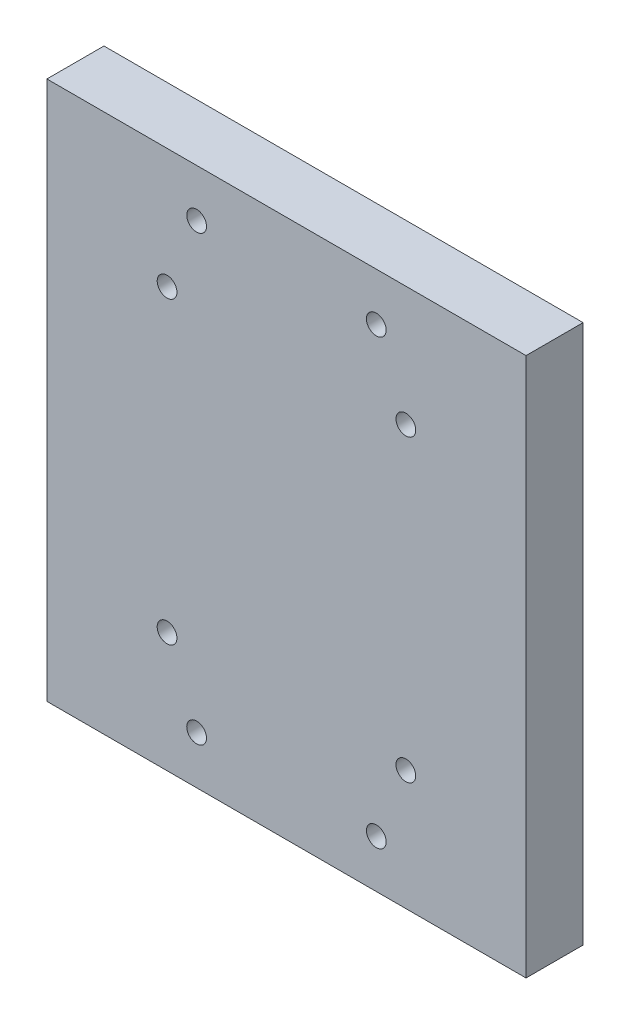
ISO-10303-21;
HEADER;
FILE_DESCRIPTION(('STEP AP214'),'2;1');
FILE_NAME('part.step','',(''),(''),'','','');
FILE_SCHEMA(('AUTOMOTIVE_DESIGN { 1 0 10303 214 1 1 1 1 }'));
ENDSEC;
DATA;
#1=APPLICATION_CONTEXT('core data for automotive mechanical design processes');
#2=APPLICATION_PROTOCOL_DEFINITION('international standard','automotive_design',2000,#1);
#3=PRODUCT_CONTEXT('',#1,'mechanical');
#4=PRODUCT('Part','Part','',(#3));
#5=PRODUCT_RELATED_PRODUCT_CATEGORY('part','',(#4));
#6=PRODUCT_DEFINITION_FORMATION('','',#4);
#7=PRODUCT_DEFINITION_CONTEXT('part definition',#1,'design');
#8=PRODUCT_DEFINITION('design','',#6,#7);
#9=PRODUCT_DEFINITION_SHAPE('','',#8);
#10=(LENGTH_UNIT() NAMED_UNIT(*) SI_UNIT(.MILLI.,.METRE.));
#11=(NAMED_UNIT(*) PLANE_ANGLE_UNIT() SI_UNIT($,.RADIAN.));
#12=(NAMED_UNIT(*) SI_UNIT($,.STERADIAN.) SOLID_ANGLE_UNIT());
#13=UNCERTAINTY_MEASURE_WITH_UNIT(LENGTH_MEASURE(1.E-05),#10,'distance_accuracy_value','');
#14=(GEOMETRIC_REPRESENTATION_CONTEXT(3) GLOBAL_UNCERTAINTY_ASSIGNED_CONTEXT((#13)) GLOBAL_UNIT_ASSIGNED_CONTEXT((#10,
#11,#12)) REPRESENTATION_CONTEXT('',''));
#15=CARTESIAN_POINT('',(0.,0.,0.));
#16=DIRECTION('',(0.,0.,1.));
#17=DIRECTION('',(1.,0.,0.));
#18=AXIS2_PLACEMENT_3D('',#15,#16,#17);
#19=CARTESIAN_POINT('',(40.,0.,9.53));
#20=DIRECTION('',(0.,1.,0.));
#21=DIRECTION('',(0.,0.,1.));
#22=AXIS2_PLACEMENT_3D('',#19,#20,#21);
#23=PLANE('',#22);
#24=DIRECTION('',(1.,0.,0.));
#25=VECTOR('',#24,1.);
#26=CARTESIAN_POINT('',(40.,0.,0.));
#27=LINE('',#26,#25);
#28=CARTESIAN_POINT('',(0.,0.,0.));
#29=VERTEX_POINT('',#28);
#30=CARTESIAN_POINT('',(80.,0.,0.));
#31=VERTEX_POINT('',#30);
#32=EDGE_CURVE('E100',#29,#31,#27,.T.);
#33=ORIENTED_EDGE('',*,*,#32,.T.);
#34=DIRECTION('',(0.,0.,-1.));
#35=VECTOR('',#34,1.);
#36=CARTESIAN_POINT('',(80.,0.,9.53));
#37=LINE('',#36,#35);
#38=CARTESIAN_POINT('',(80.,0.,9.53));
#39=VERTEX_POINT('',#38);
#40=EDGE_CURVE('E11',#39,#31,#37,.T.);
#41=ORIENTED_EDGE('',*,*,#40,.F.);
#42=DIRECTION('',(1.,0.,0.));
#43=VECTOR('',#42,1.);
#44=CARTESIAN_POINT('',(40.,0.,9.53));
#45=LINE('',#44,#43);
#46=CARTESIAN_POINT('',(0.,0.,9.53));
#47=VERTEX_POINT('',#46);
#48=EDGE_CURVE('E86',#47,#39,#45,.T.);
#49=ORIENTED_EDGE('',*,*,#48,.F.);
#50=DIRECTION('',(0.,0.,-1.));
#51=VECTOR('',#50,1.);
#52=CARTESIAN_POINT('',(0.,0.,9.53));
#53=LINE('',#52,#51);
#54=EDGE_CURVE('E53',#47,#29,#53,.T.);
#55=ORIENTED_EDGE('',*,*,#54,.T.);
#56=EDGE_LOOP('',(#33,#41,#49,#55));
#57=FACE_BOUND('',#56,.T.);
#58=ADVANCED_FACE('F37',(#57),#23,.F.);
#59=CARTESIAN_POINT('',(80.,-48.8030463688325,9.53));
#60=DIRECTION('',(-1.,0.,0.));
#61=DIRECTION('',(0.,0.,1.));
#62=AXIS2_PLACEMENT_3D('',#59,#60,#61);
#63=PLANE('',#62);
#64=DIRECTION('',(0.,1.,0.));
#65=VECTOR('',#64,1.);
#66=CARTESIAN_POINT('',(80.,-48.8030463688325,0.));
#67=LINE('',#66,#65);
#68=CARTESIAN_POINT('',(80.,90.,0.));
#69=VERTEX_POINT('',#68);
#70=EDGE_CURVE('E91',#31,#69,#67,.T.);
#71=ORIENTED_EDGE('',*,*,#70,.T.);
#72=DIRECTION('',(0.,0.,-1.));
#73=VECTOR('',#72,1.);
#74=CARTESIAN_POINT('',(80.,90.,9.53));
#75=LINE('',#74,#73);
#76=CARTESIAN_POINT('',(80.,90.,9.53));
#77=VERTEX_POINT('',#76);
#78=EDGE_CURVE('E45',#77,#69,#75,.T.);
#79=ORIENTED_EDGE('',*,*,#78,.F.);
#80=DIRECTION('',(0.,1.,0.));
#81=VECTOR('',#80,1.);
#82=CARTESIAN_POINT('',(80.,-48.8030463688325,9.53));
#83=LINE('',#82,#81);
#84=EDGE_CURVE('E78',#39,#77,#83,.T.);
#85=ORIENTED_EDGE('',*,*,#84,.F.);
#86=ORIENTED_EDGE('',*,*,#40,.T.);
#87=EDGE_LOOP('',(#71,#79,#85,#86));
#88=FACE_BOUND('',#87,.T.);
#89=ADVANCED_FACE('F90',(#88),#63,.F.);
#90=CARTESIAN_POINT('',(40.,90.,9.53));
#91=DIRECTION('',(0.,1.,0.));
#92=DIRECTION('',(0.,0.,1.));
#93=AXIS2_PLACEMENT_3D('',#90,#91,#92);
#94=PLANE('',#93);
#95=DIRECTION('',(1.,0.,0.));
#96=VECTOR('',#95,1.);
#97=CARTESIAN_POINT('',(40.,90.,0.));
#98=LINE('',#97,#96);
#99=CARTESIAN_POINT('',(0.,90.,0.));
#100=VERTEX_POINT('',#99);
#101=EDGE_CURVE('E104',#100,#69,#98,.T.);
#102=ORIENTED_EDGE('',*,*,#101,.F.);
#103=DIRECTION('',(0.,0.,-1.));
#104=VECTOR('',#103,1.);
#105=CARTESIAN_POINT('',(0.,90.,9.53));
#106=LINE('',#105,#104);
#107=CARTESIAN_POINT('',(0.,90.,9.53));
#108=VERTEX_POINT('',#107);
#109=EDGE_CURVE('E67',#108,#100,#106,.T.);
#110=ORIENTED_EDGE('',*,*,#109,.F.);
#111=DIRECTION('',(1.,0.,0.));
#112=VECTOR('',#111,1.);
#113=CARTESIAN_POINT('',(40.,90.,9.53));
#114=LINE('',#113,#112);
#115=EDGE_CURVE('E85',#108,#77,#114,.T.);
#116=ORIENTED_EDGE('',*,*,#115,.T.);
#117=ORIENTED_EDGE('',*,*,#78,.T.);
#118=EDGE_LOOP('',(#102,#110,#116,#117));
#119=FACE_BOUND('',#118,.T.);
#120=ADVANCED_FACE('F94',(#119),#94,.T.);
#121=CARTESIAN_POINT('',(0.,-48.8030463688325,9.53));
#122=DIRECTION('',(-1.,0.,0.));
#123=DIRECTION('',(0.,0.,1.));
#124=AXIS2_PLACEMENT_3D('',#121,#122,#123);
#125=PLANE('',#124);
#126=DIRECTION('',(0.,1.,0.));
#127=VECTOR('',#126,1.);
#128=CARTESIAN_POINT('',(0.,-48.8030463688325,0.));
#129=LINE('',#128,#127);
#130=EDGE_CURVE('E106',#29,#100,#129,.T.);
#131=ORIENTED_EDGE('',*,*,#130,.F.);
#132=ORIENTED_EDGE('',*,*,#54,.F.);
#133=DIRECTION('',(0.,1.,0.));
#134=VECTOR('',#133,1.);
#135=CARTESIAN_POINT('',(0.,-48.8030463688325,9.53));
#136=LINE('',#135,#134);
#137=EDGE_CURVE('E95',#47,#108,#136,.T.);
#138=ORIENTED_EDGE('',*,*,#137,.T.);
#139=ORIENTED_EDGE('',*,*,#109,.T.);
#140=EDGE_LOOP('',(#131,#132,#138,#139));
#141=FACE_BOUND('',#140,.T.);
#142=ADVANCED_FACE('F180',(#141),#125,.T.);
#143=CARTESIAN_POINT('',(40.,-48.8030463688325,9.53));
#144=DIRECTION('',(0.,0.,1.));
#145=DIRECTION('',(1.,0.,0.));
#146=AXIS2_PLACEMENT_3D('',#143,#144,#145);
#147=PLANE('',#146);
#148=CARTESIAN_POINT('',(55.,8.,9.53));
#149=DIRECTION('',(0.,0.,-1.));
#150=DIRECTION('',(-1.,0.,0.));
#151=AXIS2_PLACEMENT_3D('',#148,#149,#150);
#152=CIRCLE('',#151,1.65);
#153=CARTESIAN_POINT('',(53.35,8.,9.53));
#154=VERTEX_POINT('',#153);
#155=EDGE_CURVE('E153',#154,#154,#152,.T.);
#156=ORIENTED_EDGE('',*,*,#155,.T.);
#157=EDGE_LOOP('',(#156));
#158=FACE_BOUND('',#157,.T.);
#159=CARTESIAN_POINT('',(25.,8.,9.53));
#160=DIRECTION('',(0.,0.,-1.));
#161=DIRECTION('',(-1.,0.,0.));
#162=AXIS2_PLACEMENT_3D('',#159,#160,#161);
#163=CIRCLE('',#162,1.65);
#164=CARTESIAN_POINT('',(23.35,8.,9.53));
#165=VERTEX_POINT('',#164);
#166=EDGE_CURVE('E147',#165,#165,#163,.T.);
#167=ORIENTED_EDGE('',*,*,#166,.T.);
#168=EDGE_LOOP('',(#167));
#169=FACE_BOUND('',#168,.T.);
#170=CARTESIAN_POINT('',(25.,81.9999999999998,9.53));
#171=DIRECTION('',(0.,0.,-1.));
#172=DIRECTION('',(-1.,0.,0.));
#173=AXIS2_PLACEMENT_3D('',#170,#171,#172);
#174=CIRCLE('',#173,1.65);
#175=CARTESIAN_POINT('',(23.35,81.9999999999998,9.53));
#176=VERTEX_POINT('',#175);
#177=EDGE_CURVE('E141',#176,#176,#174,.T.);
#178=ORIENTED_EDGE('',*,*,#177,.T.);
#179=EDGE_LOOP('',(#178));
#180=FACE_BOUND('',#179,.T.);
#181=CARTESIAN_POINT('',(55.,81.9999999999998,9.53));
#182=DIRECTION('',(0.,0.,-1.));
#183=DIRECTION('',(-1.,0.,0.));
#184=AXIS2_PLACEMENT_3D('',#181,#182,#183);
#185=CIRCLE('',#184,1.65);
#186=CARTESIAN_POINT('',(53.35,81.9999999999998,9.53));
#187=VERTEX_POINT('',#186);
#188=EDGE_CURVE('E135',#187,#187,#185,.T.);
#189=ORIENTED_EDGE('',*,*,#188,.T.);
#190=EDGE_LOOP('',(#189));
#191=FACE_BOUND('',#190,.T.);
#192=CARTESIAN_POINT('',(20.065,70.,9.53));
#193=DIRECTION('',(0.,0.,1.));
#194=DIRECTION('',(1.,0.,0.));
#195=AXIS2_PLACEMENT_3D('',#192,#193,#194);
#196=CIRCLE('',#195,1.64999999999999);
#197=CARTESIAN_POINT('',(21.715,70.,9.53));
#198=VERTEX_POINT('',#197);
#199=EDGE_CURVE('E132',#198,#198,#196,.T.);
#200=ORIENTED_EDGE('',*,*,#199,.F.);
#201=EDGE_LOOP('',(#200));
#202=FACE_BOUND('',#201,.T.);
#203=CARTESIAN_POINT('',(59.935,70.,9.53));
#204=DIRECTION('',(0.,0.,1.));
#205=DIRECTION('',(1.,0.,0.));
#206=AXIS2_PLACEMENT_3D('',#203,#204,#205);
#207=CIRCLE('',#206,1.64999999999998);
#208=CARTESIAN_POINT('',(61.585,70.,9.53));
#209=VERTEX_POINT('',#208);
#210=EDGE_CURVE('E126',#209,#209,#207,.T.);
#211=ORIENTED_EDGE('',*,*,#210,.F.);
#212=EDGE_LOOP('',(#211));
#213=FACE_BOUND('',#212,.T.);
#214=CARTESIAN_POINT('',(59.935,20.,9.53));
#215=DIRECTION('',(0.,0.,1.));
#216=DIRECTION('',(1.,0.,0.));
#217=AXIS2_PLACEMENT_3D('',#214,#215,#216);
#218=CIRCLE('',#217,1.64999999999999);
#219=CARTESIAN_POINT('',(61.585,20.,9.53));
#220=VERTEX_POINT('',#219);
#221=EDGE_CURVE('E120',#220,#220,#218,.T.);
#222=ORIENTED_EDGE('',*,*,#221,.F.);
#223=EDGE_LOOP('',(#222));
#224=FACE_BOUND('',#223,.T.);
#225=CARTESIAN_POINT('',(20.065,20.,9.53));
#226=DIRECTION('',(0.,0.,1.));
#227=DIRECTION('',(1.,0.,0.));
#228=AXIS2_PLACEMENT_3D('',#225,#226,#227);
#229=CIRCLE('',#228,1.64999999999999);
#230=CARTESIAN_POINT('',(21.715,20.,9.53));
#231=VERTEX_POINT('',#230);
#232=EDGE_CURVE('E114',#231,#231,#229,.T.);
#233=ORIENTED_EDGE('',*,*,#232,.F.);
#234=EDGE_LOOP('',(#233));
#235=FACE_BOUND('',#234,.T.);
#236=ORIENTED_EDGE('',*,*,#48,.T.);
#237=ORIENTED_EDGE('',*,*,#84,.T.);
#238=ORIENTED_EDGE('',*,*,#115,.F.);
#239=ORIENTED_EDGE('',*,*,#137,.F.);
#240=EDGE_LOOP('',(#236,#237,#238,#239));
#241=FACE_BOUND('',#240,.T.);
#242=ADVANCED_FACE('F82',(#158,#169,#180,#191,#202,#213,#224,#235,#241),#147,.T.);
#243=CARTESIAN_POINT('',(40.,-48.8030463688325,0.));
#244=DIRECTION('',(0.,0.,1.));
#245=DIRECTION('',(1.,0.,0.));
#246=AXIS2_PLACEMENT_3D('',#243,#244,#245);
#247=PLANE('',#246);
#248=CARTESIAN_POINT('',(55.,8.,0.));
#249=DIRECTION('',(0.,0.,-1.));
#250=DIRECTION('',(-1.,0.,0.));
#251=AXIS2_PLACEMENT_3D('',#248,#249,#250);
#252=CIRCLE('',#251,1.64999999999999);
#253=CARTESIAN_POINT('',(53.35,8.,0.));
#254=VERTEX_POINT('',#253);
#255=EDGE_CURVE('E156',#254,#254,#252,.T.);
#256=ORIENTED_EDGE('',*,*,#255,.F.);
#257=EDGE_LOOP('',(#256));
#258=FACE_BOUND('',#257,.T.);
#259=CARTESIAN_POINT('',(25.,8.,0.));
#260=DIRECTION('',(0.,0.,-1.));
#261=DIRECTION('',(-1.,0.,0.));
#262=AXIS2_PLACEMENT_3D('',#259,#260,#261);
#263=CIRCLE('',#262,1.64999999999999);
#264=CARTESIAN_POINT('',(23.35,8.,0.));
#265=VERTEX_POINT('',#264);
#266=EDGE_CURVE('E150',#265,#265,#263,.T.);
#267=ORIENTED_EDGE('',*,*,#266,.F.);
#268=EDGE_LOOP('',(#267));
#269=FACE_BOUND('',#268,.T.);
#270=CARTESIAN_POINT('',(25.,81.9999999999998,0.));
#271=DIRECTION('',(0.,0.,-1.));
#272=DIRECTION('',(-1.,0.,0.));
#273=AXIS2_PLACEMENT_3D('',#270,#271,#272);
#274=CIRCLE('',#273,1.64999999999999);
#275=CARTESIAN_POINT('',(23.35,81.9999999999998,0.));
#276=VERTEX_POINT('',#275);
#277=EDGE_CURVE('E144',#276,#276,#274,.T.);
#278=ORIENTED_EDGE('',*,*,#277,.F.);
#279=EDGE_LOOP('',(#278));
#280=FACE_BOUND('',#279,.T.);
#281=CARTESIAN_POINT('',(55.,81.9999999999998,0.));
#282=DIRECTION('',(0.,0.,-1.));
#283=DIRECTION('',(-1.,0.,0.));
#284=AXIS2_PLACEMENT_3D('',#281,#282,#283);
#285=CIRCLE('',#284,1.64999999999999);
#286=CARTESIAN_POINT('',(53.35,81.9999999999998,0.));
#287=VERTEX_POINT('',#286);
#288=EDGE_CURVE('E138',#287,#287,#285,.T.);
#289=ORIENTED_EDGE('',*,*,#288,.F.);
#290=EDGE_LOOP('',(#289));
#291=FACE_BOUND('',#290,.T.);
#292=CARTESIAN_POINT('',(20.065,70.,0.));
#293=DIRECTION('',(0.,0.,1.));
#294=DIRECTION('',(1.,0.,0.));
#295=AXIS2_PLACEMENT_3D('',#292,#293,#294);
#296=CIRCLE('',#295,1.65);
#297=CARTESIAN_POINT('',(21.715,70.,0.));
#298=VERTEX_POINT('',#297);
#299=EDGE_CURVE('E129',#298,#298,#296,.T.);
#300=ORIENTED_EDGE('',*,*,#299,.T.);
#301=EDGE_LOOP('',(#300));
#302=FACE_BOUND('',#301,.T.);
#303=CARTESIAN_POINT('',(59.935,70.,0.));
#304=DIRECTION('',(0.,0.,1.));
#305=DIRECTION('',(1.,0.,0.));
#306=AXIS2_PLACEMENT_3D('',#303,#304,#305);
#307=CIRCLE('',#306,1.65);
#308=CARTESIAN_POINT('',(61.585,70.,0.));
#309=VERTEX_POINT('',#308);
#310=EDGE_CURVE('E123',#309,#309,#307,.T.);
#311=ORIENTED_EDGE('',*,*,#310,.T.);
#312=EDGE_LOOP('',(#311));
#313=FACE_BOUND('',#312,.T.);
#314=CARTESIAN_POINT('',(59.935,20.,0.));
#315=DIRECTION('',(0.,0.,1.));
#316=DIRECTION('',(1.,0.,0.));
#317=AXIS2_PLACEMENT_3D('',#314,#315,#316);
#318=CIRCLE('',#317,1.65);
#319=CARTESIAN_POINT('',(61.585,20.,0.));
#320=VERTEX_POINT('',#319);
#321=EDGE_CURVE('E117',#320,#320,#318,.T.);
#322=ORIENTED_EDGE('',*,*,#321,.T.);
#323=EDGE_LOOP('',(#322));
#324=FACE_BOUND('',#323,.T.);
#325=CARTESIAN_POINT('',(20.065,20.,0.));
#326=DIRECTION('',(0.,0.,1.));
#327=DIRECTION('',(1.,0.,0.));
#328=AXIS2_PLACEMENT_3D('',#325,#326,#327);
#329=CIRCLE('',#328,1.65);
#330=CARTESIAN_POINT('',(21.715,20.,0.));
#331=VERTEX_POINT('',#330);
#332=EDGE_CURVE('E102',#331,#331,#329,.T.);
#333=ORIENTED_EDGE('',*,*,#332,.T.);
#334=EDGE_LOOP('',(#333));
#335=FACE_BOUND('',#334,.T.);
#336=ORIENTED_EDGE('',*,*,#32,.F.);
#337=ORIENTED_EDGE('',*,*,#130,.T.);
#338=ORIENTED_EDGE('',*,*,#101,.T.);
#339=ORIENTED_EDGE('',*,*,#70,.F.);
#340=EDGE_LOOP('',(#336,#337,#338,#339));
#341=FACE_BOUND('',#340,.T.);
#342=ADVANCED_FACE('F162',(#258,#269,#280,#291,#302,#313,#324,#335,#341),#247,.F.);
#343=CARTESIAN_POINT('',(20.065,20.,9.53));
#344=DIRECTION('',(0.,0.,1.));
#345=DIRECTION('',(1.,0.,0.));
#346=AXIS2_PLACEMENT_3D('',#343,#344,#345);
#347=CYLINDRICAL_SURFACE('',#346,1.64999999999999);
#348=ORIENTED_EDGE('',*,*,#332,.F.);
#349=EDGE_LOOP('',(#348));
#350=FACE_BOUND('',#349,.T.);
#351=ORIENTED_EDGE('',*,*,#232,.T.);
#352=EDGE_LOOP('',(#351));
#353=FACE_BOUND('',#352,.T.);
#354=ADVANCED_FACE('F165',(#350,#353),#347,.F.);
#355=CARTESIAN_POINT('',(59.935,20.,9.53));
#356=DIRECTION('',(0.,0.,1.));
#357=DIRECTION('',(1.,0.,0.));
#358=AXIS2_PLACEMENT_3D('',#355,#356,#357);
#359=CYLINDRICAL_SURFACE('',#358,1.65);
#360=ORIENTED_EDGE('',*,*,#321,.F.);
#361=EDGE_LOOP('',(#360));
#362=FACE_BOUND('',#361,.T.);
#363=ORIENTED_EDGE('',*,*,#221,.T.);
#364=EDGE_LOOP('',(#363));
#365=FACE_BOUND('',#364,.T.);
#366=ADVANCED_FACE('F215',(#362,#365),#359,.F.);
#367=CARTESIAN_POINT('',(59.935,70.,9.53));
#368=DIRECTION('',(0.,0.,1.));
#369=DIRECTION('',(1.,0.,0.));
#370=AXIS2_PLACEMENT_3D('',#367,#368,#369);
#371=CYLINDRICAL_SURFACE('',#370,1.64999999999999);
#372=ORIENTED_EDGE('',*,*,#310,.F.);
#373=EDGE_LOOP('',(#372));
#374=FACE_BOUND('',#373,.T.);
#375=ORIENTED_EDGE('',*,*,#210,.T.);
#376=EDGE_LOOP('',(#375));
#377=FACE_BOUND('',#376,.T.);
#378=ADVANCED_FACE('F228',(#374,#377),#371,.F.);
#379=CARTESIAN_POINT('',(20.065,70.,9.53));
#380=DIRECTION('',(0.,0.,1.));
#381=DIRECTION('',(1.,0.,0.));
#382=AXIS2_PLACEMENT_3D('',#379,#380,#381);
#383=CYLINDRICAL_SURFACE('',#382,1.64999999999999);
#384=ORIENTED_EDGE('',*,*,#299,.F.);
#385=EDGE_LOOP('',(#384));
#386=FACE_BOUND('',#385,.T.);
#387=ORIENTED_EDGE('',*,*,#199,.T.);
#388=EDGE_LOOP('',(#387));
#389=FACE_BOUND('',#388,.T.);
#390=ADVANCED_FACE('F239',(#386,#389),#383,.F.);
#391=CARTESIAN_POINT('',(55.,81.9999999999998,0.));
#392=DIRECTION('',(0.,0.,-1.));
#393=DIRECTION('',(-1.,0.,0.));
#394=AXIS2_PLACEMENT_3D('',#391,#392,#393);
#395=CYLINDRICAL_SURFACE('',#394,1.65);
#396=ORIENTED_EDGE('',*,*,#188,.F.);
#397=EDGE_LOOP('',(#396));
#398=FACE_BOUND('',#397,.T.);
#399=ORIENTED_EDGE('',*,*,#288,.T.);
#400=EDGE_LOOP('',(#399));
#401=FACE_BOUND('',#400,.T.);
#402=ADVANCED_FACE('F250',(#398,#401),#395,.F.);
#403=CARTESIAN_POINT('',(25.,81.9999999999998,0.));
#404=DIRECTION('',(0.,0.,-1.));
#405=DIRECTION('',(-1.,0.,0.));
#406=AXIS2_PLACEMENT_3D('',#403,#404,#405);
#407=CYLINDRICAL_SURFACE('',#406,1.64999999999999);
#408=ORIENTED_EDGE('',*,*,#177,.F.);
#409=EDGE_LOOP('',(#408));
#410=FACE_BOUND('',#409,.T.);
#411=ORIENTED_EDGE('',*,*,#277,.T.);
#412=EDGE_LOOP('',(#411));
#413=FACE_BOUND('',#412,.T.);
#414=ADVANCED_FACE('F271',(#410,#413),#407,.F.);
#415=CARTESIAN_POINT('',(25.,8.,0.));
#416=DIRECTION('',(0.,0.,-1.));
#417=DIRECTION('',(-1.,0.,0.));
#418=AXIS2_PLACEMENT_3D('',#415,#416,#417);
#419=CYLINDRICAL_SURFACE('',#418,1.64999999999999);
#420=ORIENTED_EDGE('',*,*,#166,.F.);
#421=EDGE_LOOP('',(#420));
#422=FACE_BOUND('',#421,.T.);
#423=ORIENTED_EDGE('',*,*,#266,.T.);
#424=EDGE_LOOP('',(#423));
#425=FACE_BOUND('',#424,.T.);
#426=ADVANCED_FACE('F282',(#422,#425),#419,.F.);
#427=CARTESIAN_POINT('',(55.,8.,0.));
#428=DIRECTION('',(0.,0.,-1.));
#429=DIRECTION('',(-1.,0.,0.));
#430=AXIS2_PLACEMENT_3D('',#427,#428,#429);
#431=CYLINDRICAL_SURFACE('',#430,1.65);
#432=ORIENTED_EDGE('',*,*,#155,.F.);
#433=EDGE_LOOP('',(#432));
#434=FACE_BOUND('',#433,.T.);
#435=ORIENTED_EDGE('',*,*,#255,.T.);
#436=EDGE_LOOP('',(#435));
#437=FACE_BOUND('',#436,.T.);
#438=ADVANCED_FACE('F160',(#434,#437),#431,.F.);
#439=CLOSED_SHELL('',(#58,#89,#120,#142,#242,#342,#354,#366,#378,#390,#402,#414,#426,#438));
#440=MANIFOLD_SOLID_BREP('B2',#439);
#441=ADVANCED_BREP_SHAPE_REPRESENTATION('',(#18,#440),#14);
#442=SHAPE_DEFINITION_REPRESENTATION(#9,#441);
ENDSEC;
END-ISO-10303-21;
